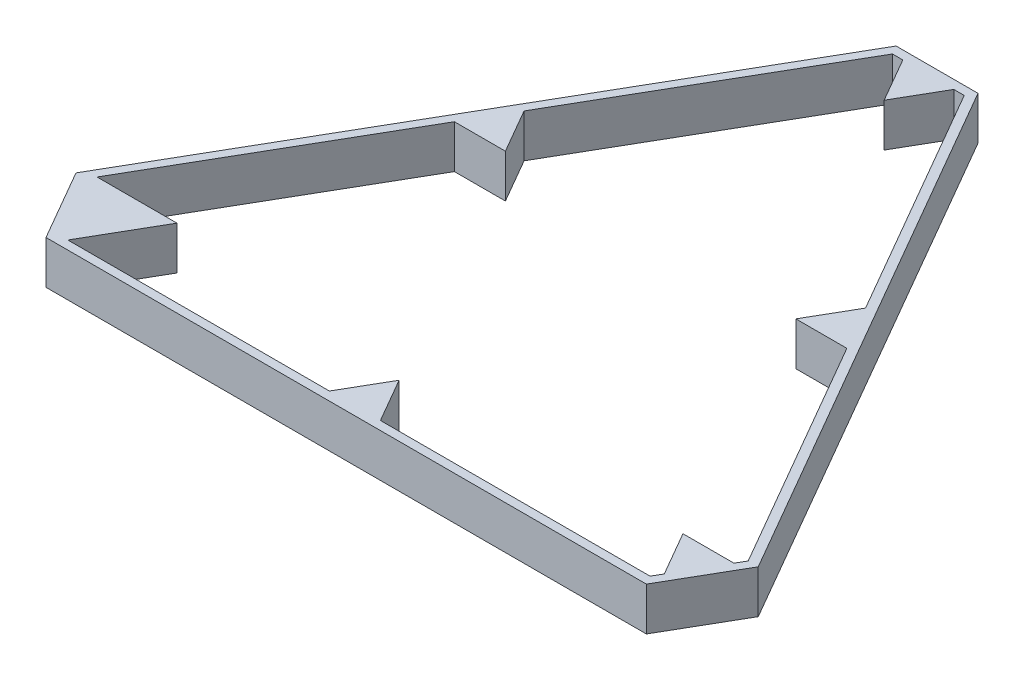
ISO-10303-21;
HEADER;
FILE_DESCRIPTION(('STEP AP214'),'2;1');
FILE_NAME('part.step','',(''),(''),'','','');
FILE_SCHEMA(('AUTOMOTIVE_DESIGN { 1 0 10303 214 1 1 1 1 }'));
ENDSEC;
DATA;
#1=APPLICATION_CONTEXT('core data for automotive mechanical design processes');
#2=APPLICATION_PROTOCOL_DEFINITION('international standard','automotive_design',2000,#1);
#3=PRODUCT_CONTEXT('',#1,'mechanical');
#4=PRODUCT('Part','Part','',(#3));
#5=PRODUCT_RELATED_PRODUCT_CATEGORY('part','',(#4));
#6=PRODUCT_DEFINITION_FORMATION('','',#4);
#7=PRODUCT_DEFINITION_CONTEXT('part definition',#1,'design');
#8=PRODUCT_DEFINITION('design','',#6,#7);
#9=PRODUCT_DEFINITION_SHAPE('','',#8);
#10=(LENGTH_UNIT() NAMED_UNIT(*) SI_UNIT(.MILLI.,.METRE.));
#11=(NAMED_UNIT(*) PLANE_ANGLE_UNIT() SI_UNIT($,.RADIAN.));
#12=(NAMED_UNIT(*) SI_UNIT($,.STERADIAN.) SOLID_ANGLE_UNIT());
#13=UNCERTAINTY_MEASURE_WITH_UNIT(LENGTH_MEASURE(1.E-05),#10,'distance_accuracy_value','');
#14=(GEOMETRIC_REPRESENTATION_CONTEXT(3) GLOBAL_UNCERTAINTY_ASSIGNED_CONTEXT((#13)) GLOBAL_UNIT_ASSIGNED_CONTEXT((#10,
#11,#12)) REPRESENTATION_CONTEXT('',''));
#15=CARTESIAN_POINT('',(0.,0.,0.));
#16=DIRECTION('',(0.,0.,1.));
#17=DIRECTION('',(1.,0.,0.));
#18=AXIS2_PLACEMENT_3D('',#15,#16,#17);
#19=CARTESIAN_POINT('',(-97.7416697506329,12.38,-18.8923048450671));
#20=DIRECTION('',(0.866025403784439,0.,-0.5));
#21=DIRECTION('',(-0.5,0.,-0.866025403784439));
#22=AXIS2_PLACEMENT_3D('',#19,#20,#21);
#23=PLANE('',#22);
#24=DIRECTION('',(0.5,0.,0.866025403784439));
#25=VECTOR('',#24,1.);
#26=CARTESIAN_POINT('',(-97.7416697506329,0.,-18.8923048450671));
#27=LINE('',#26,#25);
#28=CARTESIAN_POINT('',(-97.7416697506329,0.,-18.8923048450671));
#29=VERTEX_POINT('',#28);
#30=CARTESIAN_POINT('',(-86.0096189437243,0.,1.42820322947795));
#31=VERTEX_POINT('',#30);
#32=EDGE_CURVE('E435',#29,#31,#27,.T.);
#33=ORIENTED_EDGE('',*,*,#32,.T.);
#34=DIRECTION('',(0.,-1.,0.));
#35=VECTOR('',#34,1.);
#36=CARTESIAN_POINT('',(-86.0096189437243,12.38,1.42820322947795));
#37=LINE('',#36,#35);
#38=CARTESIAN_POINT('',(-86.0096189437243,12.38,1.42820322947795));
#39=VERTEX_POINT('',#38);
#40=EDGE_CURVE('E12',#39,#31,#37,.T.);
#41=ORIENTED_EDGE('',*,*,#40,.F.);
#42=DIRECTION('',(0.5,0.,0.866025403784439));
#43=VECTOR('',#42,1.);
#44=CARTESIAN_POINT('',(-97.7416697506329,12.38,-18.8923048450671));
#45=LINE('',#44,#43);
#46=CARTESIAN_POINT('',(-97.7416697506329,12.38,-18.8923048450671));
#47=VERTEX_POINT('',#46);
#48=EDGE_CURVE('E475',#47,#39,#45,.T.);
#49=ORIENTED_EDGE('',*,*,#48,.F.);
#50=DIRECTION('',(0.,-1.,0.));
#51=VECTOR('',#50,1.);
#52=CARTESIAN_POINT('',(-97.7416697506329,12.38,-18.8923048450671));
#53=LINE('',#52,#51);
#54=EDGE_CURVE('E492',#47,#29,#53,.T.);
#55=ORIENTED_EDGE('',*,*,#54,.T.);
#56=EDGE_LOOP('',(#33,#41,#49,#55));
#57=FACE_BOUND('',#56,.T.);
#58=ADVANCED_FACE('F117',(#57),#23,.F.);
#59=CARTESIAN_POINT('',(-86.0096189437243,12.38,1.42820322947795));
#60=DIRECTION('',(0.,0.,-1.));
#61=DIRECTION('',(-1.,0.,0.));
#62=AXIS2_PLACEMENT_3D('',#59,#60,#61);
#63=PLANE('',#62);
#64=DIRECTION('',(1.,0.,0.));
#65=VECTOR('',#64,1.);
#66=CARTESIAN_POINT('',(-86.0096189437243,0.,1.42820322947795));
#67=LINE('',#66,#65);
#68=CARTESIAN_POINT('',(86.0096189497081,0.,1.42820322947791));
#69=VERTEX_POINT('',#68);
#70=EDGE_CURVE('E495',#31,#69,#67,.T.);
#71=ORIENTED_EDGE('',*,*,#70,.T.);
#72=DIRECTION('',(0.,-1.,0.));
#73=VECTOR('',#72,1.);
#74=CARTESIAN_POINT('',(86.0096189497081,12.38,1.42820322947791));
#75=LINE('',#74,#73);
#76=CARTESIAN_POINT('',(86.0096189497081,12.38,1.42820322947791));
#77=VERTEX_POINT('',#76);
#78=EDGE_CURVE('E124',#77,#69,#75,.T.);
#79=ORIENTED_EDGE('',*,*,#78,.F.);
#80=DIRECTION('',(1.,0.,0.));
#81=VECTOR('',#80,1.);
#82=CARTESIAN_POINT('',(-86.0096189437243,12.38,1.42820322947795));
#83=LINE('',#82,#81);
#84=EDGE_CURVE('E478',#39,#77,#83,.T.);
#85=ORIENTED_EDGE('',*,*,#84,.F.);
#86=ORIENTED_EDGE('',*,*,#40,.T.);
#87=EDGE_LOOP('',(#71,#79,#85,#86));
#88=FACE_BOUND('',#87,.T.);
#89=ADVANCED_FACE('F521',(#88),#63,.F.);
#90=CARTESIAN_POINT('',(97.7416697477462,12.38,-18.8923048500671));
#91=DIRECTION('',(0.866025404001409,0.,0.499999999624197));
#92=DIRECTION('',(0.499999999624197,0.,-0.866025404001409));
#93=AXIS2_PLACEMENT_3D('',#90,#91,#92);
#94=PLANE('',#93);
#95=DIRECTION('',(-0.499999999624197,0.,0.866025404001409));
#96=VECTOR('',#95,1.);
#97=CARTESIAN_POINT('',(97.7416697477462,0.,-18.8923048500671));
#98=LINE('',#97,#96);
#99=CARTESIAN_POINT('',(97.7416697477462,0.,-18.8923048500671));
#100=VERTEX_POINT('',#99);
#101=EDGE_CURVE('E498',#100,#69,#98,.T.);
#102=ORIENTED_EDGE('',*,*,#101,.F.);
#103=DIRECTION('',(0.,-1.,0.));
#104=VECTOR('',#103,1.);
#105=CARTESIAN_POINT('',(97.7416697477462,12.38,-18.8923048500671));
#106=LINE('',#105,#104);
#107=CARTESIAN_POINT('',(97.7416697477462,12.38,-18.8923048500671));
#108=VERTEX_POINT('',#107);
#109=EDGE_CURVE('E514',#108,#100,#106,.T.);
#110=ORIENTED_EDGE('',*,*,#109,.F.);
#111=DIRECTION('',(-0.499999999624197,0.,0.866025404001409));
#112=VECTOR('',#111,1.);
#113=CARTESIAN_POINT('',(97.7416697477462,12.38,-18.8923048500671));
#114=LINE('',#113,#112);
#115=EDGE_CURVE('E481',#108,#77,#114,.T.);
#116=ORIENTED_EDGE('',*,*,#115,.T.);
#117=ORIENTED_EDGE('',*,*,#78,.T.);
#118=EDGE_LOOP('',(#102,#110,#116,#117));
#119=FACE_BOUND('',#118,.T.);
#120=ADVANCED_FACE('F518',(#119),#94,.T.);
#121=CARTESIAN_POINT('',(97.7416697477462,12.38,-18.8923048500671));
#122=DIRECTION('',(-0.86602540378444,0.,0.499999999999998));
#123=DIRECTION('',(0.499999999999998,0.,0.86602540378444));
#124=AXIS2_PLACEMENT_3D('',#121,#122,#123);
#125=PLANE('',#124);
#126=DIRECTION('',(-0.499999999999998,0.,-0.86602540378444));
#127=VECTOR('',#126,1.);
#128=CARTESIAN_POINT('',(97.7416697477462,0.,-18.8923048500671));
#129=LINE('',#128,#127);
#130=CARTESIAN_POINT('',(11.7320508029588,0.,-167.865334802078));
#131=VERTEX_POINT('',#130);
#132=EDGE_CURVE('E501',#100,#131,#129,.T.);
#133=ORIENTED_EDGE('',*,*,#132,.T.);
#134=DIRECTION('',(0.,-1.,0.));
#135=VECTOR('',#134,1.);
#136=CARTESIAN_POINT('',(11.7320508029588,12.38,-167.865334802078));
#137=LINE('',#136,#135);
#138=CARTESIAN_POINT('',(11.7320508029588,12.38,-167.865334802078));
#139=VERTEX_POINT('',#138);
#140=EDGE_CURVE('E512',#139,#131,#137,.T.);
#141=ORIENTED_EDGE('',*,*,#140,.F.);
#142=DIRECTION('',(-0.499999999999998,0.,-0.86602540378444));
#143=VECTOR('',#142,1.);
#144=CARTESIAN_POINT('',(97.7416697477462,12.38,-18.8923048500671));
#145=LINE('',#144,#143);
#146=EDGE_CURVE('E484',#108,#139,#145,.T.);
#147=ORIENTED_EDGE('',*,*,#146,.F.);
#148=ORIENTED_EDGE('',*,*,#109,.T.);
#149=EDGE_LOOP('',(#133,#141,#147,#148));
#150=FACE_BOUND('',#149,.T.);
#151=ADVANCED_FACE('F530',(#150),#125,.F.);
#152=CARTESIAN_POINT('',(-11.7320508029585,12.38,-167.865334802078));
#153=DIRECTION('',(0.,0.,-1.));
#154=DIRECTION('',(-1.,0.,0.));
#155=AXIS2_PLACEMENT_3D('',#152,#153,#154);
#156=PLANE('',#155);
#157=DIRECTION('',(1.,0.,0.));
#158=VECTOR('',#157,1.);
#159=CARTESIAN_POINT('',(-11.7320508029585,0.,-167.865334802078));
#160=LINE('',#159,#158);
#161=CARTESIAN_POINT('',(-11.7320508029585,0.,-167.865334802078));
#162=VERTEX_POINT('',#161);
#163=EDGE_CURVE('E504',#162,#131,#160,.T.);
#164=ORIENTED_EDGE('',*,*,#163,.F.);
#165=DIRECTION('',(0.,-1.,0.));
#166=VECTOR('',#165,1.);
#167=CARTESIAN_POINT('',(-11.7320508029585,12.38,-167.865334802078));
#168=LINE('',#167,#166);
#169=CARTESIAN_POINT('',(-11.7320508029585,12.38,-167.865334802078));
#170=VERTEX_POINT('',#169);
#171=EDGE_CURVE('E510',#170,#162,#168,.T.);
#172=ORIENTED_EDGE('',*,*,#171,.F.);
#173=DIRECTION('',(1.,0.,0.));
#174=VECTOR('',#173,1.);
#175=CARTESIAN_POINT('',(-11.7320508029585,12.38,-167.865334802078));
#176=LINE('',#175,#174);
#177=EDGE_CURVE('E486',#170,#139,#176,.T.);
#178=ORIENTED_EDGE('',*,*,#177,.T.);
#179=ORIENTED_EDGE('',*,*,#140,.T.);
#180=EDGE_LOOP('',(#164,#172,#178,#179));
#181=FACE_BOUND('',#180,.T.);
#182=ADVANCED_FACE('F540',(#181),#156,.T.);
#183=CARTESIAN_POINT('',(-97.7416697506329,12.38,-18.8923048450671));
#184=DIRECTION('',(-0.866025403784439,0.,-0.5));
#185=DIRECTION('',(-0.5,0.,0.866025403784439));
#186=AXIS2_PLACEMENT_3D('',#183,#184,#185);
#187=PLANE('',#186);
#188=DIRECTION('',(0.5,0.,-0.866025403784439));
#189=VECTOR('',#188,1.);
#190=CARTESIAN_POINT('',(-97.7416697506329,0.,-18.8923048450671));
#191=LINE('',#190,#189);
#192=EDGE_CURVE('E479',#29,#162,#191,.T.);
#193=ORIENTED_EDGE('',*,*,#192,.F.);
#194=ORIENTED_EDGE('',*,*,#54,.F.);
#195=DIRECTION('',(0.5,0.,-0.866025403784439));
#196=VECTOR('',#195,1.);
#197=CARTESIAN_POINT('',(-97.7416697506329,12.38,-18.8923048450671));
#198=LINE('',#197,#196);
#199=EDGE_CURVE('E489',#47,#170,#198,.T.);
#200=ORIENTED_EDGE('',*,*,#199,.T.);
#201=ORIENTED_EDGE('',*,*,#171,.T.);
#202=EDGE_LOOP('',(#193,#194,#200,#201));
#203=FACE_BOUND('',#202,.T.);
#204=ADVANCED_FACE('F538',(#203),#187,.T.);
#205=CARTESIAN_POINT('',(0.,12.38,0.));
#206=DIRECTION('',(0.,1.,0.));
#207=DIRECTION('',(0.,0.,1.));
#208=AXIS2_PLACEMENT_3D('',#205,#206,#207);
#209=PLANE('',#208);
#210=DIRECTION('',(-1.,0.,0.));
#211=VECTOR('',#210,1.);
#212=CARTESIAN_POINT('',(-70.8134665192567,12.38,-20.8923048492323));
#213=LINE('',#212,#211);
#214=CARTESIAN_POINT('',(-70.8134665192567,12.38,-20.8923048492323));
#215=VERTEX_POINT('',#214);
#216=CARTESIAN_POINT('',(-93.7002178395821,12.38,-20.8923048492323));
#217=VERTEX_POINT('',#216);
#218=EDGE_CURVE('E303',#215,#217,#213,.T.);
#219=ORIENTED_EDGE('',*,*,#218,.T.);
#220=DIRECTION('',(0.5,0.,-0.866025403784439));
#221=VECTOR('',#220,1.);
#222=CARTESIAN_POINT('',(-93.7002178395821,12.38,-20.8923048492323));
#223=LINE('',#222,#221);
#224=CARTESIAN_POINT('',(-56.2264972832898,12.38,-85.7986928013689));
#225=VERTEX_POINT('',#224);
#226=EDGE_CURVE('E309',#217,#225,#223,.T.);
#227=ORIENTED_EDGE('',*,*,#226,.T.);
#228=DIRECTION('',(-1.,0.,0.));
#229=VECTOR('',#228,1.);
#230=CARTESIAN_POINT('',(-41.6076951297721,12.38,-85.7986928013689));
#231=LINE('',#230,#229);
#232=CARTESIAN_POINT('',(-41.6076951297721,12.38,-85.7986928013689));
#233=VERTEX_POINT('',#232);
#234=EDGE_CURVE('E313',#233,#225,#231,.T.);
#235=ORIENTED_EDGE('',*,*,#234,.F.);
#236=DIRECTION('',(-0.500000000000001,0.,-0.866025403784438));
#237=VECTOR('',#236,1.);
#238=CARTESIAN_POINT('',(-41.6076951297721,12.38,-85.7986928013689));
#239=LINE('',#238,#237);
#240=CARTESIAN_POINT('',(-48.9170962065311,12.38,-98.4589468392141));
#241=VERTEX_POINT('',#240);
#242=EDGE_CURVE('E325',#233,#241,#239,.T.);
#243=ORIENTED_EDGE('',*,*,#242,.T.);
#244=DIRECTION('',(0.499999999999998,0.,-0.86602540378444));
#245=VECTOR('',#244,1.);
#246=CARTESIAN_POINT('',(-48.9170962065311,12.38,-98.4589468392141));
#247=LINE('',#246,#245);
#248=CARTESIAN_POINT('',(-10.2886751117223,12.38,-165.365334791589));
#249=VERTEX_POINT('',#248);
#250=EDGE_CURVE('E328',#241,#249,#247,.T.);
#251=ORIENTED_EDGE('',*,*,#250,.T.);
#252=DIRECTION('',(1.,0.,0.));
#253=VECTOR('',#252,1.);
#254=CARTESIAN_POINT('',(-10.2886751117223,12.38,-165.365334791589));
#255=LINE('',#254,#253);
#256=CARTESIAN_POINT('',(-7.30940107673814,12.38,-165.365334791589));
#257=VERTEX_POINT('',#256);
#258=EDGE_CURVE('E331',#249,#257,#255,.T.);
#259=ORIENTED_EDGE('',*,*,#258,.T.);
#260=DIRECTION('',(-0.5,0.,-0.866025403784438));
#261=VECTOR('',#260,1.);
#262=CARTESIAN_POINT('',(2.71895316648585E-11,12.38,-152.705080753732));
#263=LINE('',#262,#261);
#264=CARTESIAN_POINT('',(2.71895316648585E-11,12.38,-152.705080753732));
#265=VERTEX_POINT('',#264);
#266=EDGE_CURVE('E334',#265,#257,#263,.T.);
#267=ORIENTED_EDGE('',*,*,#266,.F.);
#268=DIRECTION('',(0.499999999999536,0.,-0.866025403784706));
#269=VECTOR('',#268,1.);
#270=CARTESIAN_POINT('',(2.71895316648585E-11,12.38,-152.705080753732));
#271=LINE('',#270,#269);
#272=CARTESIAN_POINT('',(7.30940107678828,12.38,-165.365334791597));
#273=VERTEX_POINT('',#272);
#274=EDGE_CURVE('E336',#265,#273,#271,.T.);
#275=ORIENTED_EDGE('',*,*,#274,.T.);
#276=DIRECTION('',(1.,0.,1.77008199053834E-13));
#277=VECTOR('',#276,1.);
#278=CARTESIAN_POINT('',(7.30940107678828,12.38,-165.365334791597));
#279=LINE('',#278,#277);
#280=CARTESIAN_POINT('',(10.2886751415821,12.38,-165.365334791596));
#281=VERTEX_POINT('',#280);
#282=EDGE_CURVE('E339',#273,#281,#279,.T.);
#283=ORIENTED_EDGE('',*,*,#282,.T.);
#284=DIRECTION('',(-0.500000000000003,0.,-0.866025403784437));
#285=VECTOR('',#284,1.);
#286=CARTESIAN_POINT('',(48.9170962396005,12.38,-98.4589468336634));
#287=LINE('',#286,#285);
#288=CARTESIAN_POINT('',(48.9170962396005,12.38,-98.4589468336634));
#289=VERTEX_POINT('',#288);
#290=EDGE_CURVE('E342',#289,#281,#287,.T.);
#291=ORIENTED_EDGE('',*,*,#290,.F.);
#292=DIRECTION('',(0.500000000000017,0.,-0.866025403784429));
#293=VECTOR('',#292,1.);
#294=CARTESIAN_POINT('',(41.607695162847,12.38,-85.7986927958282));
#295=LINE('',#294,#293);
#296=CARTESIAN_POINT('',(41.607695162847,12.38,-85.7986927958282));
#297=VERTEX_POINT('',#296);
#298=EDGE_CURVE('E344',#297,#289,#295,.T.);
#299=ORIENTED_EDGE('',*,*,#298,.F.);
#300=DIRECTION('',(1.,0.,0.));
#301=VECTOR('',#300,1.);
#302=CARTESIAN_POINT('',(41.607695162847,12.38,-85.7986927958282));
#303=LINE('',#302,#301);
#304=CARTESIAN_POINT('',(56.2264973163537,12.38,-85.7986927958282));
#305=VERTEX_POINT('',#304);
#306=EDGE_CURVE('E346',#297,#305,#303,.T.);
#307=ORIENTED_EDGE('',*,*,#306,.T.);
#308=DIRECTION('',(0.5,0.,0.866025403784439));
#309=VECTOR('',#308,1.);
#310=CARTESIAN_POINT('',(56.2264973163537,12.38,-85.7986927958282));
#311=LINE('',#310,#309);
#312=CARTESIAN_POINT('',(94.8549184123586,12.38,-18.8923048413823));
#313=VERTEX_POINT('',#312);
#314=EDGE_CURVE('E349',#305,#313,#311,.T.);
#315=ORIENTED_EDGE('',*,*,#314,.T.);
#316=DIRECTION('',(-0.49999999998308,0.,0.866025403794207));
#317=VECTOR('',#316,1.);
#318=CARTESIAN_POINT('',(94.8549184123586,12.38,-18.8923048413823));
#319=LINE('',#318,#317);
#320=CARTESIAN_POINT('',(93.3652813903454,12.38,-16.3121778343035));
#321=VERTEX_POINT('',#320);
#322=EDGE_CURVE('E352',#313,#321,#319,.T.);
#323=ORIENTED_EDGE('',*,*,#322,.T.);
#324=DIRECTION('',(1.,0.,0.));
#325=VECTOR('',#324,1.);
#326=CARTESIAN_POINT('',(78.7464792329573,12.38,-16.3121778343025));
#327=LINE('',#326,#325);
#328=CARTESIAN_POINT('',(78.7464792329573,12.38,-16.3121778343025));
#329=VERTEX_POINT('',#328);
#330=EDGE_CURVE('E355',#329,#321,#327,.T.);
#331=ORIENTED_EDGE('',*,*,#330,.F.);
#332=DIRECTION('',(0.500000000000109,0.,0.866025403784376));
#333=VECTOR('',#332,1.);
#334=CARTESIAN_POINT('',(78.7464792329573,12.38,-16.3121778343025));
#335=LINE('',#334,#333);
#336=CARTESIAN_POINT('',(86.0558803116491,12.38,-3.65192379311334));
#337=VERTEX_POINT('',#336);
#338=EDGE_CURVE('E357',#329,#337,#335,.T.);
#339=ORIENTED_EDGE('',*,*,#338,.T.);
#340=DIRECTION('',(-0.499999999999997,0.,0.866025403784441));
#341=VECTOR('',#340,1.);
#342=CARTESIAN_POINT('',(86.0558803116491,12.38,-3.65192379311334));
#343=LINE('',#342,#341);
#344=CARTESIAN_POINT('',(84.5662432934613,12.38,-1.07179679277666));
#345=VERTEX_POINT('',#344);
#346=EDGE_CURVE('E360',#337,#345,#343,.T.);
#347=ORIENTED_EDGE('',*,*,#346,.T.);
#348=DIRECTION('',(-1.,0.,0.));
#349=VECTOR('',#348,1.);
#350=CARTESIAN_POINT('',(84.5662432934613,12.38,-1.07179679277666));
#351=LINE('',#350,#349);
#352=CARTESIAN_POINT('',(7.3094010883902,12.38,-1.07179679277665));
#353=VERTEX_POINT('',#352);
#354=EDGE_CURVE('E363',#345,#353,#351,.T.);
#355=ORIENTED_EDGE('',*,*,#354,.T.);
#356=DIRECTION('',(0.500000000000001,0.,0.866025403784438));
#357=VECTOR('',#356,1.);
#358=CARTESIAN_POINT('',(1.96130221938801E-09,12.38,-13.7320508473706));
#359=LINE('',#358,#357);
#360=CARTESIAN_POINT('',(1.96130221938801E-09,12.38,-13.7320508473706));
#361=VERTEX_POINT('',#360);
#362=EDGE_CURVE('E366',#361,#353,#359,.T.);
#363=ORIENTED_EDGE('',*,*,#362,.F.);
#364=DIRECTION('',(-0.499999999990666,0.,0.866025403789828));
#365=VECTOR('',#364,1.);
#366=CARTESIAN_POINT('',(1.96130221938801E-09,12.38,-13.7320508473706));
#367=LINE('',#366,#365);
#368=CARTESIAN_POINT('',(-7.30940108257845,12.38,-1.07179679573359));
#369=VERTEX_POINT('',#368);
#370=EDGE_CURVE('E368',#361,#369,#367,.T.);
#371=ORIENTED_EDGE('',*,*,#370,.T.);
#372=DIRECTION('',(1.,0.,0.));
#373=VECTOR('',#372,1.);
#374=CARTESIAN_POINT('',(-82.2568421794194,12.38,-1.07179679573359));
#375=LINE('',#374,#373);
#376=CARTESIAN_POINT('',(-82.2568421794194,12.38,-1.07179679573359));
#377=VERTEX_POINT('',#376);
#378=EDGE_CURVE('E371',#377,#369,#375,.T.);
#379=ORIENTED_EDGE('',*,*,#378,.F.);
#380=DIRECTION('',(-0.5,0.,0.866025403784439));
#381=VECTOR('',#380,1.);
#382=CARTESIAN_POINT('',(-70.8134665192567,12.38,-20.8923048492323));
#383=LINE('',#382,#381);
#384=EDGE_CURVE('E306',#215,#377,#383,.T.);
#385=ORIENTED_EDGE('',*,*,#384,.F.);
#386=EDGE_LOOP('',(#219,#227,#235,#243,#251,#259,#267,#275,#283,#291,#299,#307,#315,#323,#331,
#339,#347,#355,#363,#371,#379,#385));
#387=FACE_BOUND('',#386,.T.);
#388=ORIENTED_EDGE('',*,*,#48,.T.);
#389=ORIENTED_EDGE('',*,*,#84,.T.);
#390=ORIENTED_EDGE('',*,*,#115,.F.);
#391=ORIENTED_EDGE('',*,*,#146,.T.);
#392=ORIENTED_EDGE('',*,*,#177,.F.);
#393=ORIENTED_EDGE('',*,*,#199,.F.);
#394=EDGE_LOOP('',(#388,#389,#390,#391,#392,#393));
#395=FACE_BOUND('',#394,.T.);
#396=ADVANCED_FACE('F315',(#387,#395),#209,.T.);
#397=CARTESIAN_POINT('',(0.,0.,0.));
#398=DIRECTION('',(0.,1.,0.));
#399=DIRECTION('',(0.,0.,1.));
#400=AXIS2_PLACEMENT_3D('',#397,#398,#399);
#401=PLANE('',#400);
#402=DIRECTION('',(0.5,0.,-0.866025403784439));
#403=VECTOR('',#402,1.);
#404=CARTESIAN_POINT('',(-93.7002178395821,0.,-20.8923048492323));
#405=LINE('',#404,#403);
#406=CARTESIAN_POINT('',(-93.7002178395821,0.,-20.8923048492323));
#407=VERTEX_POINT('',#406);
#408=CARTESIAN_POINT('',(-56.2264972832898,0.,-85.7986928013689));
#409=VERTEX_POINT('',#408);
#410=EDGE_CURVE('E375',#407,#409,#405,.T.);
#411=ORIENTED_EDGE('',*,*,#410,.F.);
#412=DIRECTION('',(-1.,0.,0.));
#413=VECTOR('',#412,1.);
#414=CARTESIAN_POINT('',(-70.8134665192567,0.,-20.8923048492323));
#415=LINE('',#414,#413);
#416=CARTESIAN_POINT('',(-70.8134665192567,0.,-20.8923048492323));
#417=VERTEX_POINT('',#416);
#418=EDGE_CURVE('E139',#417,#407,#415,.T.);
#419=ORIENTED_EDGE('',*,*,#418,.F.);
#420=DIRECTION('',(-0.5,0.,0.866025403784439));
#421=VECTOR('',#420,1.);
#422=CARTESIAN_POINT('',(-70.8134665192567,0.,-20.8923048492323));
#423=LINE('',#422,#421);
#424=CARTESIAN_POINT('',(-82.2568421794194,0.,-1.07179679573359));
#425=VERTEX_POINT('',#424);
#426=EDGE_CURVE('E318',#417,#425,#423,.T.);
#427=ORIENTED_EDGE('',*,*,#426,.T.);
#428=DIRECTION('',(1.,0.,0.));
#429=VECTOR('',#428,1.);
#430=CARTESIAN_POINT('',(-82.2568421794194,0.,-1.07179679573359));
#431=LINE('',#430,#429);
#432=CARTESIAN_POINT('',(-7.30940108257845,0.,-1.07179679573359));
#433=VERTEX_POINT('',#432);
#434=EDGE_CURVE('E321',#425,#433,#431,.T.);
#435=ORIENTED_EDGE('',*,*,#434,.T.);
#436=DIRECTION('',(-0.499999999990666,0.,0.866025403789828));
#437=VECTOR('',#436,1.);
#438=CARTESIAN_POINT('',(1.96130221938801E-09,0.,-13.7320508473706));
#439=LINE('',#438,#437);
#440=CARTESIAN_POINT('',(1.96130221938801E-09,0.,-13.7320508473706));
#441=VERTEX_POINT('',#440);
#442=EDGE_CURVE('E428',#441,#433,#439,.T.);
#443=ORIENTED_EDGE('',*,*,#442,.F.);
#444=DIRECTION('',(0.500000000000001,0.,0.866025403784438));
#445=VECTOR('',#444,1.);
#446=CARTESIAN_POINT('',(1.96130221938801E-09,0.,-13.7320508473706));
#447=LINE('',#446,#445);
#448=CARTESIAN_POINT('',(7.3094010883902,0.,-1.07179679277665));
#449=VERTEX_POINT('',#448);
#450=EDGE_CURVE('E425',#441,#449,#447,.T.);
#451=ORIENTED_EDGE('',*,*,#450,.T.);
#452=DIRECTION('',(-1.,0.,0.));
#453=VECTOR('',#452,1.);
#454=CARTESIAN_POINT('',(84.5662432934613,0.,-1.07179679277666));
#455=LINE('',#454,#453);
#456=CARTESIAN_POINT('',(84.5662432934613,0.,-1.07179679277666));
#457=VERTEX_POINT('',#456);
#458=EDGE_CURVE('E422',#457,#449,#455,.T.);
#459=ORIENTED_EDGE('',*,*,#458,.F.);
#460=DIRECTION('',(-0.499999999999997,0.,0.866025403784441));
#461=VECTOR('',#460,1.);
#462=CARTESIAN_POINT('',(86.0558803116491,0.,-3.65192379311334));
#463=LINE('',#462,#461);
#464=CARTESIAN_POINT('',(86.0558803116491,0.,-3.65192379311334));
#465=VERTEX_POINT('',#464);
#466=EDGE_CURVE('E419',#465,#457,#463,.T.);
#467=ORIENTED_EDGE('',*,*,#466,.F.);
#468=DIRECTION('',(0.500000000000109,0.,0.866025403784376));
#469=VECTOR('',#468,1.);
#470=CARTESIAN_POINT('',(78.7464792329573,0.,-16.3121778343025));
#471=LINE('',#470,#469);
#472=CARTESIAN_POINT('',(78.7464792329573,0.,-16.3121778343025));
#473=VERTEX_POINT('',#472);
#474=EDGE_CURVE('E416',#473,#465,#471,.T.);
#475=ORIENTED_EDGE('',*,*,#474,.F.);
#476=DIRECTION('',(1.,0.,0.));
#477=VECTOR('',#476,1.);
#478=CARTESIAN_POINT('',(78.7464792329573,0.,-16.3121778343025));
#479=LINE('',#478,#477);
#480=CARTESIAN_POINT('',(93.3652813903454,0.,-16.3121778343035));
#481=VERTEX_POINT('',#480);
#482=EDGE_CURVE('E413',#473,#481,#479,.T.);
#483=ORIENTED_EDGE('',*,*,#482,.T.);
#484=DIRECTION('',(-0.49999999998308,0.,0.866025403794207));
#485=VECTOR('',#484,1.);
#486=CARTESIAN_POINT('',(94.8549184123586,0.,-18.8923048413823));
#487=LINE('',#486,#485);
#488=CARTESIAN_POINT('',(94.8549184123586,0.,-18.8923048413823));
#489=VERTEX_POINT('',#488);
#490=EDGE_CURVE('E410',#489,#481,#487,.T.);
#491=ORIENTED_EDGE('',*,*,#490,.F.);
#492=DIRECTION('',(0.5,0.,0.866025403784439));
#493=VECTOR('',#492,1.);
#494=CARTESIAN_POINT('',(56.2264973163537,0.,-85.7986927958282));
#495=LINE('',#494,#493);
#496=CARTESIAN_POINT('',(56.2264973163537,0.,-85.7986927958282));
#497=VERTEX_POINT('',#496);
#498=EDGE_CURVE('E407',#497,#489,#495,.T.);
#499=ORIENTED_EDGE('',*,*,#498,.F.);
#500=DIRECTION('',(1.,0.,0.));
#501=VECTOR('',#500,1.);
#502=CARTESIAN_POINT('',(41.607695162847,0.,-85.7986927958282));
#503=LINE('',#502,#501);
#504=CARTESIAN_POINT('',(41.607695162847,0.,-85.7986927958282));
#505=VERTEX_POINT('',#504);
#506=EDGE_CURVE('E404',#505,#497,#503,.T.);
#507=ORIENTED_EDGE('',*,*,#506,.F.);
#508=DIRECTION('',(0.500000000000017,0.,-0.866025403784429));
#509=VECTOR('',#508,1.);
#510=CARTESIAN_POINT('',(41.607695162847,0.,-85.7986927958282));
#511=LINE('',#510,#509);
#512=CARTESIAN_POINT('',(48.9170962396005,0.,-98.4589468336634));
#513=VERTEX_POINT('',#512);
#514=EDGE_CURVE('E401',#505,#513,#511,.T.);
#515=ORIENTED_EDGE('',*,*,#514,.T.);
#516=DIRECTION('',(-0.500000000000003,0.,-0.866025403784437));
#517=VECTOR('',#516,1.);
#518=CARTESIAN_POINT('',(48.9170962396005,0.,-98.4589468336634));
#519=LINE('',#518,#517);
#520=CARTESIAN_POINT('',(10.2886751415821,0.,-165.365334791596));
#521=VERTEX_POINT('',#520);
#522=EDGE_CURVE('E398',#513,#521,#519,.T.);
#523=ORIENTED_EDGE('',*,*,#522,.T.);
#524=DIRECTION('',(1.,0.,1.77008199053834E-13));
#525=VECTOR('',#524,1.);
#526=CARTESIAN_POINT('',(7.30940107678828,0.,-165.365334791597));
#527=LINE('',#526,#525);
#528=CARTESIAN_POINT('',(7.30940107678828,0.,-165.365334791597));
#529=VERTEX_POINT('',#528);
#530=EDGE_CURVE('E395',#529,#521,#527,.T.);
#531=ORIENTED_EDGE('',*,*,#530,.F.);
#532=DIRECTION('',(0.499999999999536,0.,-0.866025403784706));
#533=VECTOR('',#532,1.);
#534=CARTESIAN_POINT('',(2.71895316648585E-11,0.,-152.705080753732));
#535=LINE('',#534,#533);
#536=CARTESIAN_POINT('',(2.71895316648585E-11,0.,-152.705080753732));
#537=VERTEX_POINT('',#536);
#538=EDGE_CURVE('E392',#537,#529,#535,.T.);
#539=ORIENTED_EDGE('',*,*,#538,.F.);
#540=DIRECTION('',(-0.5,0.,-0.866025403784438));
#541=VECTOR('',#540,1.);
#542=CARTESIAN_POINT('',(2.71895316648585E-11,0.,-152.705080753732));
#543=LINE('',#542,#541);
#544=CARTESIAN_POINT('',(-7.30940107673814,0.,-165.365334791589));
#545=VERTEX_POINT('',#544);
#546=EDGE_CURVE('E389',#537,#545,#543,.T.);
#547=ORIENTED_EDGE('',*,*,#546,.T.);
#548=DIRECTION('',(1.,0.,0.));
#549=VECTOR('',#548,1.);
#550=CARTESIAN_POINT('',(-10.2886751117223,0.,-165.365334791589));
#551=LINE('',#550,#549);
#552=CARTESIAN_POINT('',(-10.2886751117223,0.,-165.365334791589));
#553=VERTEX_POINT('',#552);
#554=EDGE_CURVE('E386',#553,#545,#551,.T.);
#555=ORIENTED_EDGE('',*,*,#554,.F.);
#556=DIRECTION('',(0.499999999999998,0.,-0.86602540378444));
#557=VECTOR('',#556,1.);
#558=CARTESIAN_POINT('',(-48.9170962065311,0.,-98.4589468392141));
#559=LINE('',#558,#557);
#560=CARTESIAN_POINT('',(-48.9170962065311,0.,-98.4589468392141));
#561=VERTEX_POINT('',#560);
#562=EDGE_CURVE('E383',#561,#553,#559,.T.);
#563=ORIENTED_EDGE('',*,*,#562,.F.);
#564=DIRECTION('',(-0.500000000000001,0.,-0.866025403784438));
#565=VECTOR('',#564,1.);
#566=CARTESIAN_POINT('',(-41.6076951297721,0.,-85.7986928013689));
#567=LINE('',#566,#565);
#568=CARTESIAN_POINT('',(-41.6076951297721,0.,-85.7986928013689));
#569=VERTEX_POINT('',#568);
#570=EDGE_CURVE('E380',#569,#561,#567,.T.);
#571=ORIENTED_EDGE('',*,*,#570,.F.);
#572=DIRECTION('',(-1.,0.,0.));
#573=VECTOR('',#572,1.);
#574=CARTESIAN_POINT('',(-41.6076951297721,0.,-85.7986928013689));
#575=LINE('',#574,#573);
#576=EDGE_CURVE('E377',#569,#409,#575,.T.);
#577=ORIENTED_EDGE('',*,*,#576,.T.);
#578=EDGE_LOOP('',(#411,#419,#427,#435,#443,#451,#459,#467,#475,#483,#491,#499,#507,#515,#523,
#531,#539,#547,#555,#563,#571,#577));
#579=FACE_BOUND('',#578,.T.);
#580=ORIENTED_EDGE('',*,*,#32,.F.);
#581=ORIENTED_EDGE('',*,*,#192,.T.);
#582=ORIENTED_EDGE('',*,*,#163,.T.);
#583=ORIENTED_EDGE('',*,*,#132,.F.);
#584=ORIENTED_EDGE('',*,*,#101,.T.);
#585=ORIENTED_EDGE('',*,*,#70,.F.);
#586=EDGE_LOOP('',(#580,#581,#582,#583,#584,#585));
#587=FACE_BOUND('',#586,.T.);
#588=ADVANCED_FACE('F526',(#579,#587),#401,.F.);
#589=CARTESIAN_POINT('',(-70.8134665192567,12.38,-20.8923048492323));
#590=DIRECTION('',(0.,0.,1.));
#591=DIRECTION('',(1.,0.,0.));
#592=AXIS2_PLACEMENT_3D('',#589,#590,#591);
#593=PLANE('',#592);
#594=ORIENTED_EDGE('',*,*,#418,.T.);
#595=DIRECTION('',(0.,-1.,0.));
#596=VECTOR('',#595,1.);
#597=CARTESIAN_POINT('',(-93.7002178395821,12.38,-20.8923048492323));
#598=LINE('',#597,#596);
#599=EDGE_CURVE('E300',#217,#407,#598,.T.);
#600=ORIENTED_EDGE('',*,*,#599,.F.);
#601=ORIENTED_EDGE('',*,*,#218,.F.);
#602=DIRECTION('',(0.,-1.,0.));
#603=VECTOR('',#602,1.);
#604=CARTESIAN_POINT('',(-70.8134665192567,12.38,-20.8923048492323));
#605=LINE('',#604,#603);
#606=EDGE_CURVE('E433',#215,#417,#605,.T.);
#607=ORIENTED_EDGE('',*,*,#606,.T.);
#608=EDGE_LOOP('',(#594,#600,#601,#607));
#609=FACE_BOUND('',#608,.T.);
#610=ADVANCED_FACE('F301',(#609),#593,.F.);
#611=CARTESIAN_POINT('',(-70.8134665192567,12.38,-20.8923048492323));
#612=DIRECTION('',(0.866025403784439,0.,0.5));
#613=DIRECTION('',(0.5,0.,-0.866025403784439));
#614=AXIS2_PLACEMENT_3D('',#611,#612,#613);
#615=PLANE('',#614);
#616=ORIENTED_EDGE('',*,*,#426,.F.);
#617=ORIENTED_EDGE('',*,*,#606,.F.);
#618=ORIENTED_EDGE('',*,*,#384,.T.);
#619=DIRECTION('',(0.,-1.,0.));
#620=VECTOR('',#619,1.);
#621=CARTESIAN_POINT('',(-82.2568421794194,12.38,-1.07179679573359));
#622=LINE('',#621,#620);
#623=EDGE_CURVE('E436',#377,#425,#622,.T.);
#624=ORIENTED_EDGE('',*,*,#623,.T.);
#625=EDGE_LOOP('',(#616,#617,#618,#624));
#626=FACE_BOUND('',#625,.T.);
#627=ADVANCED_FACE('F599',(#626),#615,.T.);
#628=CARTESIAN_POINT('',(-82.2568421794194,12.38,-1.07179679573359));
#629=DIRECTION('',(0.,0.,-1.));
#630=DIRECTION('',(-1.,0.,0.));
#631=AXIS2_PLACEMENT_3D('',#628,#629,#630);
#632=PLANE('',#631);
#633=ORIENTED_EDGE('',*,*,#434,.F.);
#634=ORIENTED_EDGE('',*,*,#623,.F.);
#635=ORIENTED_EDGE('',*,*,#378,.T.);
#636=DIRECTION('',(0.,-1.,0.));
#637=VECTOR('',#636,1.);
#638=CARTESIAN_POINT('',(-7.30940108257845,12.38,-1.07179679573359));
#639=LINE('',#638,#637);
#640=EDGE_CURVE('E438',#369,#433,#639,.T.);
#641=ORIENTED_EDGE('',*,*,#640,.T.);
#642=EDGE_LOOP('',(#633,#634,#635,#641));
#643=FACE_BOUND('',#642,.T.);
#644=ADVANCED_FACE('F608',(#643),#632,.T.);
#645=CARTESIAN_POINT('',(1.96130221938801E-09,12.38,-13.7320508473706));
#646=DIRECTION('',(0.866025403789828,0.,0.499999999990666));
#647=DIRECTION('',(0.499999999990666,0.,-0.866025403789828));
#648=AXIS2_PLACEMENT_3D('',#645,#646,#647);
#649=PLANE('',#648);
#650=ORIENTED_EDGE('',*,*,#442,.T.);
#651=ORIENTED_EDGE('',*,*,#640,.F.);
#652=ORIENTED_EDGE('',*,*,#370,.F.);
#653=DIRECTION('',(0.,-1.,0.));
#654=VECTOR('',#653,1.);
#655=CARTESIAN_POINT('',(1.96130221938801E-09,12.38,-13.7320508473706));
#656=LINE('',#655,#654);
#657=EDGE_CURVE('E440',#361,#441,#656,.T.);
#658=ORIENTED_EDGE('',*,*,#657,.T.);
#659=EDGE_LOOP('',(#650,#651,#652,#658));
#660=FACE_BOUND('',#659,.T.);
#661=ADVANCED_FACE('F618',(#660),#649,.F.);
#662=CARTESIAN_POINT('',(1.96130221938801E-09,12.38,-13.7320508473706));
#663=DIRECTION('',(0.866025403784438,0.,-0.500000000000001));
#664=DIRECTION('',(-0.500000000000001,0.,-0.866025403784438));
#665=AXIS2_PLACEMENT_3D('',#662,#663,#664);
#666=PLANE('',#665);
#667=ORIENTED_EDGE('',*,*,#450,.F.);
#668=ORIENTED_EDGE('',*,*,#657,.F.);
#669=ORIENTED_EDGE('',*,*,#362,.T.);
#670=DIRECTION('',(0.,-1.,0.));
#671=VECTOR('',#670,1.);
#672=CARTESIAN_POINT('',(7.3094010883902,12.38,-1.07179679277665));
#673=LINE('',#672,#671);
#674=EDGE_CURVE('E442',#353,#449,#673,.T.);
#675=ORIENTED_EDGE('',*,*,#674,.T.);
#676=EDGE_LOOP('',(#667,#668,#669,#675));
#677=FACE_BOUND('',#676,.T.);
#678=ADVANCED_FACE('F628',(#677),#666,.T.);
#679=CARTESIAN_POINT('',(84.5662432934613,12.38,-1.07179679277666));
#680=DIRECTION('',(0.,0.,1.));
#681=DIRECTION('',(1.,0.,0.));
#682=AXIS2_PLACEMENT_3D('',#679,#680,#681);
#683=PLANE('',#682);
#684=ORIENTED_EDGE('',*,*,#458,.T.);
#685=ORIENTED_EDGE('',*,*,#674,.F.);
#686=ORIENTED_EDGE('',*,*,#354,.F.);
#687=DIRECTION('',(0.,-1.,0.));
#688=VECTOR('',#687,1.);
#689=CARTESIAN_POINT('',(84.5662432934613,12.38,-1.07179679277666));
#690=LINE('',#689,#688);
#691=EDGE_CURVE('E444',#345,#457,#690,.T.);
#692=ORIENTED_EDGE('',*,*,#691,.T.);
#693=EDGE_LOOP('',(#684,#685,#686,#692));
#694=FACE_BOUND('',#693,.T.);
#695=ADVANCED_FACE('F638',(#694),#683,.F.);
#696=CARTESIAN_POINT('',(86.0558803116491,12.38,-3.65192379311334));
#697=DIRECTION('',(0.866025403784441,0.,0.499999999999997));
#698=DIRECTION('',(0.499999999999997,0.,-0.866025403784441));
#699=AXIS2_PLACEMENT_3D('',#696,#697,#698);
#700=PLANE('',#699);
#701=ORIENTED_EDGE('',*,*,#466,.T.);
#702=ORIENTED_EDGE('',*,*,#691,.F.);
#703=ORIENTED_EDGE('',*,*,#346,.F.);
#704=DIRECTION('',(0.,-1.,0.));
#705=VECTOR('',#704,1.);
#706=CARTESIAN_POINT('',(86.0558803116491,12.38,-3.65192379311334));
#707=LINE('',#706,#705);
#708=EDGE_CURVE('E446',#337,#465,#707,.T.);
#709=ORIENTED_EDGE('',*,*,#708,.T.);
#710=EDGE_LOOP('',(#701,#702,#703,#709));
#711=FACE_BOUND('',#710,.T.);
#712=ADVANCED_FACE('F648',(#711),#700,.F.);
#713=CARTESIAN_POINT('',(78.7464792329573,12.38,-16.3121778343025));
#714=DIRECTION('',(0.866025403784376,0.,-0.500000000000109));
#715=DIRECTION('',(-0.500000000000109,0.,-0.866025403784376));
#716=AXIS2_PLACEMENT_3D('',#713,#714,#715);
#717=PLANE('',#716);
#718=ORIENTED_EDGE('',*,*,#474,.T.);
#719=ORIENTED_EDGE('',*,*,#708,.F.);
#720=ORIENTED_EDGE('',*,*,#338,.F.);
#721=DIRECTION('',(0.,-1.,0.));
#722=VECTOR('',#721,1.);
#723=CARTESIAN_POINT('',(78.7464792329573,12.38,-16.3121778343025));
#724=LINE('',#723,#722);
#725=EDGE_CURVE('E448',#329,#473,#724,.T.);
#726=ORIENTED_EDGE('',*,*,#725,.T.);
#727=EDGE_LOOP('',(#718,#719,#720,#726));
#728=FACE_BOUND('',#727,.T.);
#729=ADVANCED_FACE('F658',(#728),#717,.F.);
#730=CARTESIAN_POINT('',(78.7464792329573,12.38,-16.3121778343025));
#731=DIRECTION('',(0.,0.,-1.));
#732=DIRECTION('',(-1.,0.,0.));
#733=AXIS2_PLACEMENT_3D('',#730,#731,#732);
#734=PLANE('',#733);
#735=ORIENTED_EDGE('',*,*,#482,.F.);
#736=ORIENTED_EDGE('',*,*,#725,.F.);
#737=ORIENTED_EDGE('',*,*,#330,.T.);
#738=DIRECTION('',(0.,-1.,0.));
#739=VECTOR('',#738,1.);
#740=CARTESIAN_POINT('',(93.3652813903454,12.38,-16.3121778343035));
#741=LINE('',#740,#739);
#742=EDGE_CURVE('E450',#321,#481,#741,.T.);
#743=ORIENTED_EDGE('',*,*,#742,.T.);
#744=EDGE_LOOP('',(#735,#736,#737,#743));
#745=FACE_BOUND('',#744,.T.);
#746=ADVANCED_FACE('F668',(#745),#734,.T.);
#747=CARTESIAN_POINT('',(94.8549184123586,12.38,-18.8923048413823));
#748=DIRECTION('',(0.866025403794207,0.,0.49999999998308));
#749=DIRECTION('',(0.49999999998308,0.,-0.866025403794207));
#750=AXIS2_PLACEMENT_3D('',#747,#748,#749);
#751=PLANE('',#750);
#752=ORIENTED_EDGE('',*,*,#490,.T.);
#753=ORIENTED_EDGE('',*,*,#742,.F.);
#754=ORIENTED_EDGE('',*,*,#322,.F.);
#755=DIRECTION('',(0.,-1.,0.));
#756=VECTOR('',#755,1.);
#757=CARTESIAN_POINT('',(94.8549184123586,12.38,-18.8923048413823));
#758=LINE('',#757,#756);
#759=EDGE_CURVE('E452',#313,#489,#758,.T.);
#760=ORIENTED_EDGE('',*,*,#759,.T.);
#761=EDGE_LOOP('',(#752,#753,#754,#760));
#762=FACE_BOUND('',#761,.T.);
#763=ADVANCED_FACE('F678',(#762),#751,.F.);
#764=CARTESIAN_POINT('',(56.2264973163537,12.38,-85.7986927958282));
#765=DIRECTION('',(0.866025403784439,0.,-0.5));
#766=DIRECTION('',(-0.5,0.,-0.866025403784439));
#767=AXIS2_PLACEMENT_3D('',#764,#765,#766);
#768=PLANE('',#767);
#769=ORIENTED_EDGE('',*,*,#498,.T.);
#770=ORIENTED_EDGE('',*,*,#759,.F.);
#771=ORIENTED_EDGE('',*,*,#314,.F.);
#772=DIRECTION('',(0.,-1.,0.));
#773=VECTOR('',#772,1.);
#774=CARTESIAN_POINT('',(56.2264973163537,12.38,-85.7986927958282));
#775=LINE('',#774,#773);
#776=EDGE_CURVE('E454',#305,#497,#775,.T.);
#777=ORIENTED_EDGE('',*,*,#776,.T.);
#778=EDGE_LOOP('',(#769,#770,#771,#777));
#779=FACE_BOUND('',#778,.T.);
#780=ADVANCED_FACE('F688',(#779),#768,.F.);
#781=CARTESIAN_POINT('',(41.607695162847,12.38,-85.7986927958282));
#782=DIRECTION('',(0.,0.,-1.));
#783=DIRECTION('',(-1.,0.,0.));
#784=AXIS2_PLACEMENT_3D('',#781,#782,#783);
#785=PLANE('',#784);
#786=ORIENTED_EDGE('',*,*,#506,.T.);
#787=ORIENTED_EDGE('',*,*,#776,.F.);
#788=ORIENTED_EDGE('',*,*,#306,.F.);
#789=DIRECTION('',(0.,-1.,0.));
#790=VECTOR('',#789,1.);
#791=CARTESIAN_POINT('',(41.607695162847,12.38,-85.7986927958282));
#792=LINE('',#791,#790);
#793=EDGE_CURVE('E456',#297,#505,#792,.T.);
#794=ORIENTED_EDGE('',*,*,#793,.T.);
#795=EDGE_LOOP('',(#786,#787,#788,#794));
#796=FACE_BOUND('',#795,.T.);
#797=ADVANCED_FACE('F698',(#796),#785,.F.);
#798=CARTESIAN_POINT('',(41.607695162847,12.38,-85.7986927958282));
#799=DIRECTION('',(-0.866025403784429,0.,-0.500000000000017));
#800=DIRECTION('',(-0.500000000000017,0.,0.866025403784429));
#801=AXIS2_PLACEMENT_3D('',#798,#799,#800);
#802=PLANE('',#801);
#803=ORIENTED_EDGE('',*,*,#514,.F.);
#804=ORIENTED_EDGE('',*,*,#793,.F.);
#805=ORIENTED_EDGE('',*,*,#298,.T.);
#806=DIRECTION('',(0.,-1.,0.));
#807=VECTOR('',#806,1.);
#808=CARTESIAN_POINT('',(48.9170962396005,12.38,-98.4589468336634));
#809=LINE('',#808,#807);
#810=EDGE_CURVE('E458',#289,#513,#809,.T.);
#811=ORIENTED_EDGE('',*,*,#810,.T.);
#812=EDGE_LOOP('',(#803,#804,#805,#811));
#813=FACE_BOUND('',#812,.T.);
#814=ADVANCED_FACE('F708',(#813),#802,.T.);
#815=CARTESIAN_POINT('',(48.9170962396005,12.38,-98.4589468336634));
#816=DIRECTION('',(-0.866025403784437,0.,0.500000000000003));
#817=DIRECTION('',(0.500000000000003,0.,0.866025403784437));
#818=AXIS2_PLACEMENT_3D('',#815,#816,#817);
#819=PLANE('',#818);
#820=ORIENTED_EDGE('',*,*,#522,.F.);
#821=ORIENTED_EDGE('',*,*,#810,.F.);
#822=ORIENTED_EDGE('',*,*,#290,.T.);
#823=DIRECTION('',(0.,-1.,0.));
#824=VECTOR('',#823,1.);
#825=CARTESIAN_POINT('',(10.2886751415821,12.38,-165.365334791596));
#826=LINE('',#825,#824);
#827=EDGE_CURVE('E460',#281,#521,#826,.T.);
#828=ORIENTED_EDGE('',*,*,#827,.T.);
#829=EDGE_LOOP('',(#820,#821,#822,#828));
#830=FACE_BOUND('',#829,.T.);
#831=ADVANCED_FACE('F718',(#830),#819,.T.);
#832=CARTESIAN_POINT('',(7.30940107678828,12.38,-165.365334791597));
#833=DIRECTION('',(1.77008199053834E-13,0.,-1.));
#834=DIRECTION('',(-1.,0.,-1.77008199053834E-13));
#835=AXIS2_PLACEMENT_3D('',#832,#833,#834);
#836=PLANE('',#835);
#837=ORIENTED_EDGE('',*,*,#530,.T.);
#838=ORIENTED_EDGE('',*,*,#827,.F.);
#839=ORIENTED_EDGE('',*,*,#282,.F.);
#840=DIRECTION('',(0.,-1.,0.));
#841=VECTOR('',#840,1.);
#842=CARTESIAN_POINT('',(7.30940107678828,12.38,-165.365334791597));
#843=LINE('',#842,#841);
#844=EDGE_CURVE('E462',#273,#529,#843,.T.);
#845=ORIENTED_EDGE('',*,*,#844,.T.);
#846=EDGE_LOOP('',(#837,#838,#839,#845));
#847=FACE_BOUND('',#846,.T.);
#848=ADVANCED_FACE('F728',(#847),#836,.F.);
#849=CARTESIAN_POINT('',(2.71895316648585E-11,12.38,-152.705080753732));
#850=DIRECTION('',(-0.866025403784706,0.,-0.499999999999536));
#851=DIRECTION('',(-0.499999999999536,0.,0.866025403784706));
#852=AXIS2_PLACEMENT_3D('',#849,#850,#851);
#853=PLANE('',#852);
#854=ORIENTED_EDGE('',*,*,#538,.T.);
#855=ORIENTED_EDGE('',*,*,#844,.F.);
#856=ORIENTED_EDGE('',*,*,#274,.F.);
#857=DIRECTION('',(0.,-1.,0.));
#858=VECTOR('',#857,1.);
#859=CARTESIAN_POINT('',(2.71895316648585E-11,12.38,-152.705080753732));
#860=LINE('',#859,#858);
#861=EDGE_CURVE('E464',#265,#537,#860,.T.);
#862=ORIENTED_EDGE('',*,*,#861,.T.);
#863=EDGE_LOOP('',(#854,#855,#856,#862));
#864=FACE_BOUND('',#863,.T.);
#865=ADVANCED_FACE('F738',(#864),#853,.F.);
#866=CARTESIAN_POINT('',(2.71895316648585E-11,12.38,-152.705080753732));
#867=DIRECTION('',(-0.866025403784438,0.,0.5));
#868=DIRECTION('',(0.5,0.,0.866025403784438));
#869=AXIS2_PLACEMENT_3D('',#866,#867,#868);
#870=PLANE('',#869);
#871=ORIENTED_EDGE('',*,*,#546,.F.);
#872=ORIENTED_EDGE('',*,*,#861,.F.);
#873=ORIENTED_EDGE('',*,*,#266,.T.);
#874=DIRECTION('',(0.,-1.,0.));
#875=VECTOR('',#874,1.);
#876=CARTESIAN_POINT('',(-7.30940107673814,12.38,-165.365334791589));
#877=LINE('',#876,#875);
#878=EDGE_CURVE('E466',#257,#545,#877,.T.);
#879=ORIENTED_EDGE('',*,*,#878,.T.);
#880=EDGE_LOOP('',(#871,#872,#873,#879));
#881=FACE_BOUND('',#880,.T.);
#882=ADVANCED_FACE('F748',(#881),#870,.T.);
#883=CARTESIAN_POINT('',(-10.2886751117223,12.38,-165.365334791589));
#884=DIRECTION('',(0.,0.,-1.));
#885=DIRECTION('',(-1.,0.,0.));
#886=AXIS2_PLACEMENT_3D('',#883,#884,#885);
#887=PLANE('',#886);
#888=ORIENTED_EDGE('',*,*,#554,.T.);
#889=ORIENTED_EDGE('',*,*,#878,.F.);
#890=ORIENTED_EDGE('',*,*,#258,.F.);
#891=DIRECTION('',(0.,-1.,0.));
#892=VECTOR('',#891,1.);
#893=CARTESIAN_POINT('',(-10.2886751117223,12.38,-165.365334791589));
#894=LINE('',#893,#892);
#895=EDGE_CURVE('E468',#249,#553,#894,.T.);
#896=ORIENTED_EDGE('',*,*,#895,.T.);
#897=EDGE_LOOP('',(#888,#889,#890,#896));
#898=FACE_BOUND('',#897,.T.);
#899=ADVANCED_FACE('F758',(#898),#887,.F.);
#900=CARTESIAN_POINT('',(-48.9170962065311,12.38,-98.4589468392141));
#901=DIRECTION('',(-0.86602540378444,0.,-0.499999999999998));
#902=DIRECTION('',(-0.499999999999998,0.,0.86602540378444));
#903=AXIS2_PLACEMENT_3D('',#900,#901,#902);
#904=PLANE('',#903);
#905=ORIENTED_EDGE('',*,*,#562,.T.);
#906=ORIENTED_EDGE('',*,*,#895,.F.);
#907=ORIENTED_EDGE('',*,*,#250,.F.);
#908=DIRECTION('',(0.,-1.,0.));
#909=VECTOR('',#908,1.);
#910=CARTESIAN_POINT('',(-48.9170962065311,12.38,-98.4589468392141));
#911=LINE('',#910,#909);
#912=EDGE_CURVE('E470',#241,#561,#911,.T.);
#913=ORIENTED_EDGE('',*,*,#912,.T.);
#914=EDGE_LOOP('',(#905,#906,#907,#913));
#915=FACE_BOUND('',#914,.T.);
#916=ADVANCED_FACE('F768',(#915),#904,.F.);
#917=CARTESIAN_POINT('',(-41.6076951297721,12.38,-85.7986928013689));
#918=DIRECTION('',(-0.866025403784438,0.,0.500000000000001));
#919=DIRECTION('',(0.500000000000001,0.,0.866025403784438));
#920=AXIS2_PLACEMENT_3D('',#917,#918,#919);
#921=PLANE('',#920);
#922=ORIENTED_EDGE('',*,*,#570,.T.);
#923=ORIENTED_EDGE('',*,*,#912,.F.);
#924=ORIENTED_EDGE('',*,*,#242,.F.);
#925=DIRECTION('',(0.,-1.,0.));
#926=VECTOR('',#925,1.);
#927=CARTESIAN_POINT('',(-41.6076951297721,12.38,-85.7986928013689));
#928=LINE('',#927,#926);
#929=EDGE_CURVE('E472',#233,#569,#928,.T.);
#930=ORIENTED_EDGE('',*,*,#929,.T.);
#931=EDGE_LOOP('',(#922,#923,#924,#930));
#932=FACE_BOUND('',#931,.T.);
#933=ADVANCED_FACE('F778',(#932),#921,.F.);
#934=CARTESIAN_POINT('',(-41.6076951297721,12.38,-85.7986928013689));
#935=DIRECTION('',(0.,0.,1.));
#936=DIRECTION('',(1.,0.,0.));
#937=AXIS2_PLACEMENT_3D('',#934,#935,#936);
#938=PLANE('',#937);
#939=ORIENTED_EDGE('',*,*,#576,.F.);
#940=ORIENTED_EDGE('',*,*,#929,.F.);
#941=ORIENTED_EDGE('',*,*,#234,.T.);
#942=DIRECTION('',(0.,-1.,0.));
#943=VECTOR('',#942,1.);
#944=CARTESIAN_POINT('',(-56.2264972832898,12.38,-85.7986928013689));
#945=LINE('',#944,#943);
#946=EDGE_CURVE('E131',#225,#409,#945,.T.);
#947=ORIENTED_EDGE('',*,*,#946,.T.);
#948=EDGE_LOOP('',(#939,#940,#941,#947));
#949=FACE_BOUND('',#948,.T.);
#950=ADVANCED_FACE('F788',(#949),#938,.T.);
#951=CARTESIAN_POINT('',(-93.7002178395821,12.38,-20.8923048492323));
#952=DIRECTION('',(-0.866025403784439,0.,-0.5));
#953=DIRECTION('',(-0.5,0.,0.866025403784439));
#954=AXIS2_PLACEMENT_3D('',#951,#952,#953);
#955=PLANE('',#954);
#956=ORIENTED_EDGE('',*,*,#410,.T.);
#957=ORIENTED_EDGE('',*,*,#946,.F.);
#958=ORIENTED_EDGE('',*,*,#226,.F.);
#959=ORIENTED_EDGE('',*,*,#599,.T.);
#960=EDGE_LOOP('',(#956,#957,#958,#959));
#961=FACE_BOUND('',#960,.T.);
#962=ADVANCED_FACE('F310',(#961),#955,.F.);
#963=CLOSED_SHELL('',(#58,#89,#120,#151,#182,#204,#396,#588,#610,#627,#644,#661,#678,#695,#712,
#729,#746,#763,#780,#797,#814,#831,#848,#865,#882,#899,#916,#933,#950,#962));
#964=MANIFOLD_SOLID_BREP('B2',#963);
#965=ADVANCED_BREP_SHAPE_REPRESENTATION('',(#18,#964),#14);
#966=SHAPE_DEFINITION_REPRESENTATION(#9,#965);
ENDSEC;
END-ISO-10303-21;
